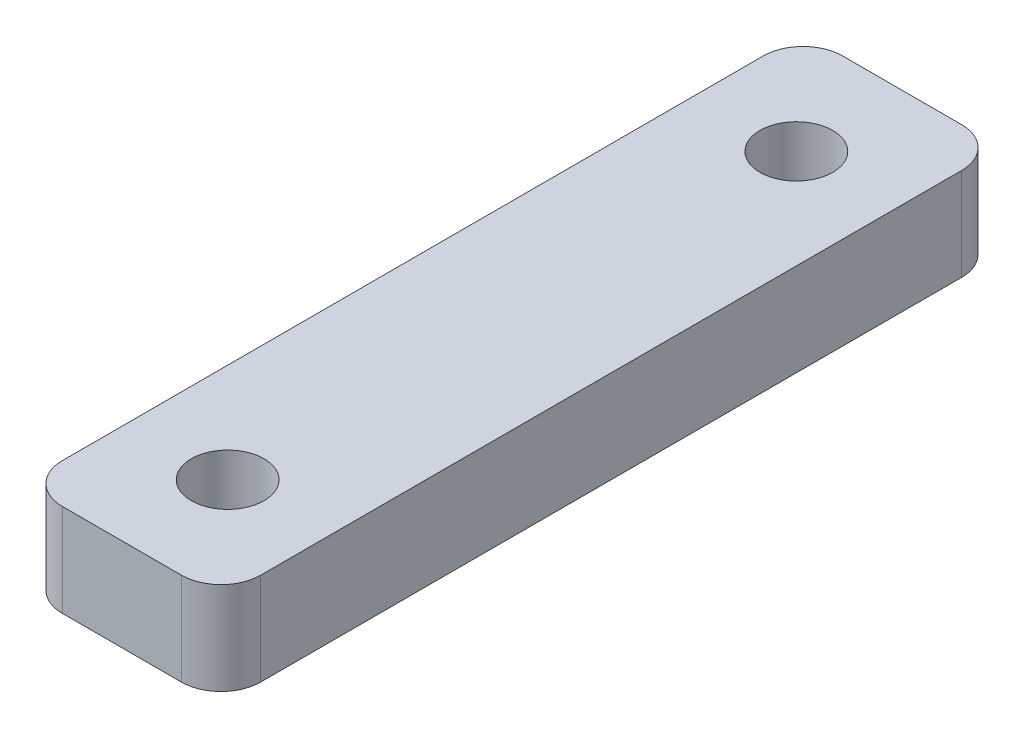
ISO-10303-21;
HEADER;
FILE_DESCRIPTION(('STEP AP214'),'2;1');
FILE_NAME('part.step','',(''),(''),'','','');
FILE_SCHEMA(('AUTOMOTIVE_DESIGN { 1 0 10303 214 1 1 1 1 }'));
ENDSEC;
DATA;
#1=APPLICATION_CONTEXT('core data for automotive mechanical design processes');
#2=APPLICATION_PROTOCOL_DEFINITION('international standard','automotive_design',2000,#1);
#3=PRODUCT_CONTEXT('',#1,'mechanical');
#4=PRODUCT('Part','Part','',(#3));
#5=PRODUCT_RELATED_PRODUCT_CATEGORY('part','',(#4));
#6=PRODUCT_DEFINITION_FORMATION('','',#4);
#7=PRODUCT_DEFINITION_CONTEXT('part definition',#1,'design');
#8=PRODUCT_DEFINITION('design','',#6,#7);
#9=PRODUCT_DEFINITION_SHAPE('','',#8);
#10=(LENGTH_UNIT() NAMED_UNIT(*) SI_UNIT(.MILLI.,.METRE.));
#11=(NAMED_UNIT(*) PLANE_ANGLE_UNIT() SI_UNIT($,.RADIAN.));
#12=(NAMED_UNIT(*) SI_UNIT($,.STERADIAN.) SOLID_ANGLE_UNIT());
#13=UNCERTAINTY_MEASURE_WITH_UNIT(LENGTH_MEASURE(1.E-05),#10,'distance_accuracy_value','');
#14=(GEOMETRIC_REPRESENTATION_CONTEXT(3) GLOBAL_UNCERTAINTY_ASSIGNED_CONTEXT((#13)) GLOBAL_UNIT_ASSIGNED_CONTEXT((#10,
#11,#12)) REPRESENTATION_CONTEXT('',''));
#15=CARTESIAN_POINT('',(0.,0.,0.));
#16=DIRECTION('',(0.,0.,1.));
#17=DIRECTION('',(1.,0.,0.));
#18=AXIS2_PLACEMENT_3D('',#15,#16,#17);
#19=CARTESIAN_POINT('',(3.,7.,0.));
#20=DIRECTION('',(0.,-1.,0.));
#21=DIRECTION('',(0.,0.,-1.));
#22=AXIS2_PLACEMENT_3D('',#19,#20,#21);
#23=PLANE('',#22);
#24=CARTESIAN_POINT('',(3.,7.,0.));
#25=DIRECTION('',(0.,1.,0.));
#26=DIRECTION('',(0.,0.,-1.));
#27=AXIS2_PLACEMENT_3D('',#24,#25,#26);
#28=CIRCLE('',#27,3.);
#29=CARTESIAN_POINT('',(0.,7.,0.));
#30=VERTEX_POINT('',#29);
#31=CARTESIAN_POINT('',(3.,7.,3.));
#32=VERTEX_POINT('',#31);
#33=EDGE_CURVE('E160',#30,#32,#28,.T.);
#34=ORIENTED_EDGE('',*,*,#33,.T.);
#35=DIRECTION('',(1.,0.,0.));
#36=VECTOR('',#35,1.);
#37=CARTESIAN_POINT('',(12.,7.,3.));
#38=LINE('',#37,#36);
#39=CARTESIAN_POINT('',(12.,7.,3.));
#40=VERTEX_POINT('',#39);
#41=EDGE_CURVE('E95',#32,#40,#38,.T.);
#42=ORIENTED_EDGE('',*,*,#41,.T.);
#43=CARTESIAN_POINT('',(12.,7.,0.));
#44=DIRECTION('',(0.,1.,0.));
#45=DIRECTION('',(0.,0.,-1.));
#46=AXIS2_PLACEMENT_3D('',#43,#44,#45);
#47=CIRCLE('',#46,3.);
#48=CARTESIAN_POINT('',(15.,7.,0.));
#49=VERTEX_POINT('',#48);
#50=EDGE_CURVE('E182',#40,#49,#47,.T.);
#51=ORIENTED_EDGE('',*,*,#50,.T.);
#52=DIRECTION('',(0.,0.,-1.));
#53=VECTOR('',#52,1.);
#54=CARTESIAN_POINT('',(15.,7.,-53.));
#55=LINE('',#54,#53);
#56=CARTESIAN_POINT('',(15.,7.,-53.));
#57=VERTEX_POINT('',#56);
#58=EDGE_CURVE('E196',#49,#57,#55,.T.);
#59=ORIENTED_EDGE('',*,*,#58,.T.);
#60=CARTESIAN_POINT('',(12.,7.,-53.));
#61=DIRECTION('',(0.,1.,0.));
#62=DIRECTION('',(0.,0.,-1.));
#63=AXIS2_PLACEMENT_3D('',#60,#61,#62);
#64=CIRCLE('',#63,3.);
#65=CARTESIAN_POINT('',(12.,7.,-56.));
#66=VERTEX_POINT('',#65);
#67=EDGE_CURVE('E114',#57,#66,#64,.T.);
#68=ORIENTED_EDGE('',*,*,#67,.T.);
#69=DIRECTION('',(-1.,0.,0.));
#70=VECTOR('',#69,1.);
#71=CARTESIAN_POINT('',(3.,7.,-56.));
#72=LINE('',#71,#70);
#73=CARTESIAN_POINT('',(3.,7.,-56.));
#74=VERTEX_POINT('',#73);
#75=EDGE_CURVE('E108',#66,#74,#72,.T.);
#76=ORIENTED_EDGE('',*,*,#75,.T.);
#77=CARTESIAN_POINT('',(3.,7.,-53.));
#78=DIRECTION('',(0.,1.,0.));
#79=DIRECTION('',(0.,0.,-1.));
#80=AXIS2_PLACEMENT_3D('',#77,#78,#79);
#81=CIRCLE('',#80,3.);
#82=CARTESIAN_POINT('',(0.,7.,-53.));
#83=VERTEX_POINT('',#82);
#84=EDGE_CURVE('E112',#74,#83,#81,.T.);
#85=ORIENTED_EDGE('',*,*,#84,.T.);
#86=DIRECTION('',(0.,0.,1.));
#87=VECTOR('',#86,1.);
#88=CARTESIAN_POINT('',(0.,7.,0.));
#89=LINE('',#88,#87);
#90=EDGE_CURVE('E52',#83,#30,#89,.T.);
#91=ORIENTED_EDGE('',*,*,#90,.T.);
#92=EDGE_LOOP('',(#34,#42,#51,#59,#68,#76,#85,#91));
#93=FACE_BOUND('',#92,.T.);
#94=CARTESIAN_POINT('',(7.5,7.,-48.));
#95=DIRECTION('',(0.,1.,0.));
#96=DIRECTION('',(0.,0.,1.));
#97=AXIS2_PLACEMENT_3D('',#94,#95,#96);
#98=CIRCLE('',#97,2.75);
#99=CARTESIAN_POINT('',(7.5,7.,-45.25));
#100=VERTEX_POINT('',#99);
#101=EDGE_CURVE('E142',#100,#100,#98,.T.);
#102=ORIENTED_EDGE('',*,*,#101,.F.);
#103=EDGE_LOOP('',(#102));
#104=FACE_BOUND('',#103,.T.);
#105=CARTESIAN_POINT('',(7.50000000000001,7.,-5.));
#106=DIRECTION('',(0.,1.,0.));
#107=DIRECTION('',(0.,0.,1.));
#108=AXIS2_PLACEMENT_3D('',#105,#106,#107);
#109=CIRCLE('',#108,2.75);
#110=CARTESIAN_POINT('',(7.50000000000001,7.,-2.25));
#111=VERTEX_POINT('',#110);
#112=EDGE_CURVE('E211',#111,#111,#109,.T.);
#113=ORIENTED_EDGE('',*,*,#112,.F.);
#114=EDGE_LOOP('',(#113));
#115=FACE_BOUND('',#114,.T.);
#116=ADVANCED_FACE('F34',(#93,#104,#115),#23,.F.);
#117=CARTESIAN_POINT('',(3.,0.,0.));
#118=DIRECTION('',(0.,-1.,0.));
#119=DIRECTION('',(0.,0.,-1.));
#120=AXIS2_PLACEMENT_3D('',#117,#118,#119);
#121=PLANE('',#120);
#122=CARTESIAN_POINT('',(7.5,0.,-48.));
#123=DIRECTION('',(0.,1.,0.));
#124=DIRECTION('',(0.,0.,1.));
#125=AXIS2_PLACEMENT_3D('',#122,#123,#124);
#126=CIRCLE('',#125,2.75);
#127=CARTESIAN_POINT('',(7.5,0.,-45.25));
#128=VERTEX_POINT('',#127);
#129=EDGE_CURVE('E207',#128,#128,#126,.T.);
#130=ORIENTED_EDGE('',*,*,#129,.T.);
#131=EDGE_LOOP('',(#130));
#132=FACE_BOUND('',#131,.T.);
#133=CARTESIAN_POINT('',(3.,0.,0.));
#134=DIRECTION('',(0.,1.,0.));
#135=DIRECTION('',(0.,0.,-1.));
#136=AXIS2_PLACEMENT_3D('',#133,#134,#135);
#137=CIRCLE('',#136,3.);
#138=CARTESIAN_POINT('',(0.,0.,0.));
#139=VERTEX_POINT('',#138);
#140=CARTESIAN_POINT('',(3.,0.,3.));
#141=VERTEX_POINT('',#140);
#142=EDGE_CURVE('E137',#139,#141,#137,.T.);
#143=ORIENTED_EDGE('',*,*,#142,.F.);
#144=DIRECTION('',(0.,0.,1.));
#145=VECTOR('',#144,1.);
#146=CARTESIAN_POINT('',(0.,0.,0.));
#147=LINE('',#146,#145);
#148=CARTESIAN_POINT('',(0.,0.,-53.));
#149=VERTEX_POINT('',#148);
#150=EDGE_CURVE('E87',#149,#139,#147,.T.);
#151=ORIENTED_EDGE('',*,*,#150,.F.);
#152=CARTESIAN_POINT('',(3.,0.,-53.));
#153=DIRECTION('',(0.,1.,0.));
#154=DIRECTION('',(0.,0.,-1.));
#155=AXIS2_PLACEMENT_3D('',#152,#153,#154);
#156=CIRCLE('',#155,3.);
#157=CARTESIAN_POINT('',(3.,0.,-56.));
#158=VERTEX_POINT('',#157);
#159=EDGE_CURVE('E81',#158,#149,#156,.T.);
#160=ORIENTED_EDGE('',*,*,#159,.F.);
#161=DIRECTION('',(-1.,0.,0.));
#162=VECTOR('',#161,1.);
#163=CARTESIAN_POINT('',(3.,0.,-56.));
#164=LINE('',#163,#162);
#165=CARTESIAN_POINT('',(12.,0.,-56.));
#166=VERTEX_POINT('',#165);
#167=EDGE_CURVE('E123',#166,#158,#164,.T.);
#168=ORIENTED_EDGE('',*,*,#167,.F.);
#169=CARTESIAN_POINT('',(12.,0.,-53.));
#170=DIRECTION('',(0.,1.,0.));
#171=DIRECTION('',(0.,0.,-1.));
#172=AXIS2_PLACEMENT_3D('',#169,#170,#171);
#173=CIRCLE('',#172,3.);
#174=CARTESIAN_POINT('',(15.,0.,-53.));
#175=VERTEX_POINT('',#174);
#176=EDGE_CURVE('E151',#175,#166,#173,.T.);
#177=ORIENTED_EDGE('',*,*,#176,.F.);
#178=DIRECTION('',(0.,0.,-1.));
#179=VECTOR('',#178,1.);
#180=CARTESIAN_POINT('',(15.,0.,-53.));
#181=LINE('',#180,#179);
#182=CARTESIAN_POINT('',(15.,0.,0.));
#183=VERTEX_POINT('',#182);
#184=EDGE_CURVE('E148',#183,#175,#181,.T.);
#185=ORIENTED_EDGE('',*,*,#184,.F.);
#186=CARTESIAN_POINT('',(12.,0.,0.));
#187=DIRECTION('',(0.,1.,0.));
#188=DIRECTION('',(0.,0.,-1.));
#189=AXIS2_PLACEMENT_3D('',#186,#187,#188);
#190=CIRCLE('',#189,3.);
#191=CARTESIAN_POINT('',(12.,0.,3.));
#192=VERTEX_POINT('',#191);
#193=EDGE_CURVE('E145',#192,#183,#190,.T.);
#194=ORIENTED_EDGE('',*,*,#193,.F.);
#195=DIRECTION('',(1.,0.,0.));
#196=VECTOR('',#195,1.);
#197=CARTESIAN_POINT('',(12.,0.,3.));
#198=LINE('',#197,#196);
#199=EDGE_CURVE('E141',#141,#192,#198,.T.);
#200=ORIENTED_EDGE('',*,*,#199,.F.);
#201=EDGE_LOOP('',(#143,#151,#160,#168,#177,#185,#194,#200));
#202=FACE_BOUND('',#201,.T.);
#203=CARTESIAN_POINT('',(7.50000000000001,0.,-5.));
#204=DIRECTION('',(0.,1.,0.));
#205=DIRECTION('',(0.,0.,1.));
#206=AXIS2_PLACEMENT_3D('',#203,#204,#205);
#207=CIRCLE('',#206,2.75);
#208=CARTESIAN_POINT('',(7.50000000000001,0.,-2.25));
#209=VERTEX_POINT('',#208);
#210=EDGE_CURVE('E215',#209,#209,#207,.T.);
#211=ORIENTED_EDGE('',*,*,#210,.T.);
#212=EDGE_LOOP('',(#211));
#213=FACE_BOUND('',#212,.T.);
#214=ADVANCED_FACE('F186',(#132,#202,#213),#121,.T.);
#215=CARTESIAN_POINT('',(3.,7.,0.));
#216=DIRECTION('',(0.,-1.,0.));
#217=DIRECTION('',(0.,0.,-1.));
#218=AXIS2_PLACEMENT_3D('',#215,#216,#217);
#219=CYLINDRICAL_SURFACE('',#218,3.);
#220=ORIENTED_EDGE('',*,*,#142,.T.);
#221=DIRECTION('',(0.,-1.,0.));
#222=VECTOR('',#221,1.);
#223=CARTESIAN_POINT('',(3.,7.,3.));
#224=LINE('',#223,#222);
#225=EDGE_CURVE('E11',#32,#141,#224,.T.);
#226=ORIENTED_EDGE('',*,*,#225,.F.);
#227=ORIENTED_EDGE('',*,*,#33,.F.);
#228=DIRECTION('',(0.,-1.,0.));
#229=VECTOR('',#228,1.);
#230=CARTESIAN_POINT('',(0.,7.,0.));
#231=LINE('',#230,#229);
#232=EDGE_CURVE('E133',#30,#139,#231,.T.);
#233=ORIENTED_EDGE('',*,*,#232,.T.);
#234=EDGE_LOOP('',(#220,#226,#227,#233));
#235=FACE_BOUND('',#234,.T.);
#236=ADVANCED_FACE('F36',(#235),#219,.T.);
#237=CARTESIAN_POINT('',(12.,7.,3.));
#238=DIRECTION('',(0.,0.,-1.));
#239=DIRECTION('',(-1.,0.,0.));
#240=AXIS2_PLACEMENT_3D('',#237,#238,#239);
#241=PLANE('',#240);
#242=ORIENTED_EDGE('',*,*,#199,.T.);
#243=DIRECTION('',(0.,-1.,0.));
#244=VECTOR('',#243,1.);
#245=CARTESIAN_POINT('',(12.,7.,3.));
#246=LINE('',#245,#244);
#247=EDGE_CURVE('E44',#40,#192,#246,.T.);
#248=ORIENTED_EDGE('',*,*,#247,.F.);
#249=ORIENTED_EDGE('',*,*,#41,.F.);
#250=ORIENTED_EDGE('',*,*,#225,.T.);
#251=EDGE_LOOP('',(#242,#248,#249,#250));
#252=FACE_BOUND('',#251,.T.);
#253=ADVANCED_FACE('F250',(#252),#241,.F.);
#254=CARTESIAN_POINT('',(12.,7.,0.));
#255=DIRECTION('',(0.,-1.,0.));
#256=DIRECTION('',(0.,0.,-1.));
#257=AXIS2_PLACEMENT_3D('',#254,#255,#256);
#258=CYLINDRICAL_SURFACE('',#257,3.);
#259=ORIENTED_EDGE('',*,*,#193,.T.);
#260=DIRECTION('',(0.,-1.,0.));
#261=VECTOR('',#260,1.);
#262=CARTESIAN_POINT('',(15.,7.,0.));
#263=LINE('',#262,#261);
#264=EDGE_CURVE('E171',#49,#183,#263,.T.);
#265=ORIENTED_EDGE('',*,*,#264,.F.);
#266=ORIENTED_EDGE('',*,*,#50,.F.);
#267=ORIENTED_EDGE('',*,*,#247,.T.);
#268=EDGE_LOOP('',(#259,#265,#266,#267));
#269=FACE_BOUND('',#268,.T.);
#270=ADVANCED_FACE('F180',(#269),#258,.T.);
#271=CARTESIAN_POINT('',(15.,7.,-53.));
#272=DIRECTION('',(-1.,0.,0.));
#273=DIRECTION('',(0.,0.,1.));
#274=AXIS2_PLACEMENT_3D('',#271,#272,#273);
#275=PLANE('',#274);
#276=ORIENTED_EDGE('',*,*,#184,.T.);
#277=DIRECTION('',(0.,-1.,0.));
#278=VECTOR('',#277,1.);
#279=CARTESIAN_POINT('',(15.,7.,-53.));
#280=LINE('',#279,#278);
#281=EDGE_CURVE('E167',#57,#175,#280,.T.);
#282=ORIENTED_EDGE('',*,*,#281,.F.);
#283=ORIENTED_EDGE('',*,*,#58,.F.);
#284=ORIENTED_EDGE('',*,*,#264,.T.);
#285=EDGE_LOOP('',(#276,#282,#283,#284));
#286=FACE_BOUND('',#285,.T.);
#287=ADVANCED_FACE('F191',(#286),#275,.F.);
#288=CARTESIAN_POINT('',(12.,7.,-53.));
#289=DIRECTION('',(0.,-1.,0.));
#290=DIRECTION('',(0.,0.,-1.));
#291=AXIS2_PLACEMENT_3D('',#288,#289,#290);
#292=CYLINDRICAL_SURFACE('',#291,3.);
#293=ORIENTED_EDGE('',*,*,#176,.T.);
#294=DIRECTION('',(0.,-1.,0.));
#295=VECTOR('',#294,1.);
#296=CARTESIAN_POINT('',(12.,7.,-56.));
#297=LINE('',#296,#295);
#298=EDGE_CURVE('E125',#66,#166,#297,.T.);
#299=ORIENTED_EDGE('',*,*,#298,.F.);
#300=ORIENTED_EDGE('',*,*,#67,.F.);
#301=ORIENTED_EDGE('',*,*,#281,.T.);
#302=EDGE_LOOP('',(#293,#299,#300,#301));
#303=FACE_BOUND('',#302,.T.);
#304=ADVANCED_FACE('F194',(#303),#292,.T.);
#305=CARTESIAN_POINT('',(3.,7.,-56.));
#306=DIRECTION('',(0.,0.,1.));
#307=DIRECTION('',(1.,0.,0.));
#308=AXIS2_PLACEMENT_3D('',#305,#306,#307);
#309=PLANE('',#308);
#310=ORIENTED_EDGE('',*,*,#167,.T.);
#311=DIRECTION('',(0.,-1.,0.));
#312=VECTOR('',#311,1.);
#313=CARTESIAN_POINT('',(3.,7.,-56.));
#314=LINE('',#313,#312);
#315=EDGE_CURVE('E120',#74,#158,#314,.T.);
#316=ORIENTED_EDGE('',*,*,#315,.F.);
#317=ORIENTED_EDGE('',*,*,#75,.F.);
#318=ORIENTED_EDGE('',*,*,#298,.T.);
#319=EDGE_LOOP('',(#310,#316,#317,#318));
#320=FACE_BOUND('',#319,.T.);
#321=ADVANCED_FACE('F121',(#320),#309,.F.);
#322=CARTESIAN_POINT('',(3.,7.,-53.));
#323=DIRECTION('',(0.,-1.,0.));
#324=DIRECTION('',(0.,0.,-1.));
#325=AXIS2_PLACEMENT_3D('',#322,#323,#324);
#326=CYLINDRICAL_SURFACE('',#325,3.);
#327=ORIENTED_EDGE('',*,*,#159,.T.);
#328=DIRECTION('',(0.,-1.,0.));
#329=VECTOR('',#328,1.);
#330=CARTESIAN_POINT('',(0.,7.,-53.));
#331=LINE('',#330,#329);
#332=EDGE_CURVE('E126',#83,#149,#331,.T.);
#333=ORIENTED_EDGE('',*,*,#332,.F.);
#334=ORIENTED_EDGE('',*,*,#84,.F.);
#335=ORIENTED_EDGE('',*,*,#315,.T.);
#336=EDGE_LOOP('',(#327,#333,#334,#335));
#337=FACE_BOUND('',#336,.T.);
#338=ADVANCED_FACE('F128',(#337),#326,.T.);
#339=CARTESIAN_POINT('',(0.,7.,0.));
#340=DIRECTION('',(1.,0.,0.));
#341=DIRECTION('',(0.,0.,-1.));
#342=AXIS2_PLACEMENT_3D('',#339,#340,#341);
#343=PLANE('',#342);
#344=ORIENTED_EDGE('',*,*,#150,.T.);
#345=ORIENTED_EDGE('',*,*,#232,.F.);
#346=ORIENTED_EDGE('',*,*,#90,.F.);
#347=ORIENTED_EDGE('',*,*,#332,.T.);
#348=EDGE_LOOP('',(#344,#345,#346,#347));
#349=FACE_BOUND('',#348,.T.);
#350=ADVANCED_FACE('F238',(#349),#343,.F.);
#351=CARTESIAN_POINT('',(7.5,7.,-48.));
#352=DIRECTION('',(0.,-1.,0.));
#353=DIRECTION('',(0.,0.,-1.));
#354=AXIS2_PLACEMENT_3D('',#351,#352,#353);
#355=CYLINDRICAL_SURFACE('',#354,2.75);
#356=ORIENTED_EDGE('',*,*,#101,.T.);
#357=EDGE_LOOP('',(#356));
#358=FACE_BOUND('',#357,.T.);
#359=ORIENTED_EDGE('',*,*,#129,.F.);
#360=EDGE_LOOP('',(#359));
#361=FACE_BOUND('',#360,.T.);
#362=ADVANCED_FACE('F235',(#358,#361),#355,.F.);
#363=CARTESIAN_POINT('',(7.50000000000001,7.,-5.));
#364=DIRECTION('',(0.,-1.,0.));
#365=DIRECTION('',(0.,0.,-1.));
#366=AXIS2_PLACEMENT_3D('',#363,#364,#365);
#367=CYLINDRICAL_SURFACE('',#366,2.75);
#368=ORIENTED_EDGE('',*,*,#112,.T.);
#369=EDGE_LOOP('',(#368));
#370=FACE_BOUND('',#369,.T.);
#371=ORIENTED_EDGE('',*,*,#210,.F.);
#372=EDGE_LOOP('',(#371));
#373=FACE_BOUND('',#372,.T.);
#374=ADVANCED_FACE('F224',(#370,#373),#367,.F.);
#375=CLOSED_SHELL('',(#116,#214,#236,#253,#270,#287,#304,#321,#338,#350,#362,#374));
#376=MANIFOLD_SOLID_BREP('B2',#375);
#377=ADVANCED_BREP_SHAPE_REPRESENTATION('',(#18,#376),#14);
#378=SHAPE_DEFINITION_REPRESENTATION(#9,#377);
ENDSEC;
END-ISO-10303-21;
